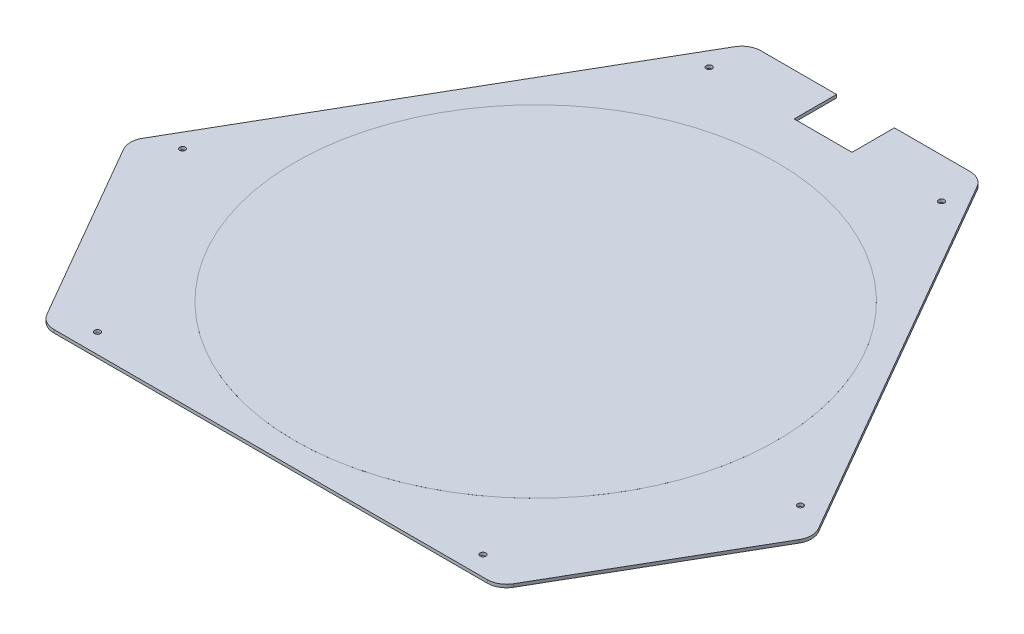
ISO-10303-21;
HEADER;
FILE_DESCRIPTION(('STEP AP214'),'2;1');
FILE_NAME('part.step','',(''),(''),'','','');
FILE_SCHEMA(('AUTOMOTIVE_DESIGN { 1 0 10303 214 1 1 1 1 }'));
ENDSEC;
DATA;
#1=APPLICATION_CONTEXT('core data for automotive mechanical design processes');
#2=APPLICATION_PROTOCOL_DEFINITION('international standard','automotive_design',2000,#1);
#3=PRODUCT_CONTEXT('',#1,'mechanical');
#4=PRODUCT('Part','Part','',(#3));
#5=PRODUCT_RELATED_PRODUCT_CATEGORY('part','',(#4));
#6=PRODUCT_DEFINITION_FORMATION('','',#4);
#7=PRODUCT_DEFINITION_CONTEXT('part definition',#1,'design');
#8=PRODUCT_DEFINITION('design','',#6,#7);
#9=PRODUCT_DEFINITION_SHAPE('','',#8);
#10=(LENGTH_UNIT() NAMED_UNIT(*) SI_UNIT(.MILLI.,.METRE.));
#11=(NAMED_UNIT(*) PLANE_ANGLE_UNIT() SI_UNIT($,.RADIAN.));
#12=(NAMED_UNIT(*) SI_UNIT($,.STERADIAN.) SOLID_ANGLE_UNIT());
#13=UNCERTAINTY_MEASURE_WITH_UNIT(LENGTH_MEASURE(1.E-05),#10,'distance_accuracy_value','');
#14=(GEOMETRIC_REPRESENTATION_CONTEXT(3) GLOBAL_UNCERTAINTY_ASSIGNED_CONTEXT((#13)) GLOBAL_UNIT_ASSIGNED_CONTEXT((#10,
#11,#12)) REPRESENTATION_CONTEXT('',''));
#15=CARTESIAN_POINT('',(0.,0.,0.));
#16=DIRECTION('',(0.,0.,1.));
#17=DIRECTION('',(1.,0.,0.));
#18=AXIS2_PLACEMENT_3D('',#15,#16,#17);
#19=CARTESIAN_POINT('',(60.,1.6,-171.076951545867));
#20=DIRECTION('',(0.,0.,1.));
#21=DIRECTION('',(1.,0.,0.));
#22=AXIS2_PLACEMENT_3D('',#19,#20,#21);
#23=PLANE('',#22);
#24=DIRECTION('',(-1.,0.,0.));
#25=VECTOR('',#24,1.);
#26=CARTESIAN_POINT('',(60.,1.6,-171.076951545867));
#27=LINE('',#26,#25);
#28=CARTESIAN_POINT('',(-15.,1.6,-171.076951545867));
#29=VERTEX_POINT('',#28);
#30=CARTESIAN_POINT('',(-54.2264973081037,1.6,-171.076951545867));
#31=VERTEX_POINT('',#30);
#32=EDGE_CURVE('E199',#29,#31,#27,.T.);
#33=ORIENTED_EDGE('',*,*,#32,.F.);
#34=DIRECTION('',(0.,1.,0.));
#35=VECTOR('',#34,1.);
#36=CARTESIAN_POINT('',(-15.,0.,-171.076951545867));
#37=LINE('',#36,#35);
#38=CARTESIAN_POINT('',(-15.,0.,-171.076951545867));
#39=VERTEX_POINT('',#38);
#40=EDGE_CURVE('E185',#39,#29,#37,.T.);
#41=ORIENTED_EDGE('',*,*,#40,.F.);
#42=DIRECTION('',(-1.,0.,0.));
#43=VECTOR('',#42,1.);
#44=CARTESIAN_POINT('',(60.,0.,-171.076951545867));
#45=LINE('',#44,#43);
#46=CARTESIAN_POINT('',(-54.2264973081037,0.,-171.076951545867));
#47=VERTEX_POINT('',#46);
#48=EDGE_CURVE('E172',#39,#47,#45,.T.);
#49=ORIENTED_EDGE('',*,*,#48,.T.);
#50=DIRECTION('',(0.,-1.,0.));
#51=VECTOR('',#50,1.);
#52=CARTESIAN_POINT('',(-54.2264973081037,1.6,-171.076951545867));
#53=LINE('',#52,#51);
#54=EDGE_CURVE('E211',#47,#31,#53,.F.);
#55=ORIENTED_EDGE('',*,*,#54,.T.);
#56=EDGE_LOOP('',(#33,#41,#49,#55));
#57=FACE_BOUND('',#56,.T.);
#58=ADVANCED_FACE('F38',(#57),#23,.F.);
#59=CARTESIAN_POINT('',(118.156986040721,1.6,137.5));
#60=DIRECTION('',(-0.866025403784438,0.,-0.5));
#61=DIRECTION('',(-0.5,0.,0.866025403784439));
#62=AXIS2_PLACEMENT_3D('',#59,#60,#61);
#63=PLANE('',#62);
#64=DIRECTION('',(0.5,0.,-0.866025403784438));
#65=VECTOR('',#64,1.);
#66=CARTESIAN_POINT('',(118.156986040721,0.,137.5));
#67=LINE('',#66,#65);
#68=CARTESIAN_POINT('',(121.043737386669,0.,132.5));
#69=VERTEX_POINT('',#68);
#70=CARTESIAN_POINT('',(175.270234694772,0.,38.5769515458674));
#71=VERTEX_POINT('',#70);
#72=EDGE_CURVE('E187',#69,#71,#67,.T.);
#73=ORIENTED_EDGE('',*,*,#72,.T.);
#74=DIRECTION('',(0.,-1.,0.));
#75=VECTOR('',#74,1.);
#76=CARTESIAN_POINT('',(175.270234694772,1.6,38.5769515458674));
#77=LINE('',#76,#75);
#78=CARTESIAN_POINT('',(175.270234694772,1.6,38.5769515458674));
#79=VERTEX_POINT('',#78);
#80=EDGE_CURVE('E11',#71,#79,#77,.F.);
#81=ORIENTED_EDGE('',*,*,#80,.T.);
#82=DIRECTION('',(0.5,0.,-0.866025403784438));
#83=VECTOR('',#82,1.);
#84=CARTESIAN_POINT('',(118.156986040721,1.6,137.5));
#85=LINE('',#84,#83);
#86=CARTESIAN_POINT('',(121.043737386669,1.6,132.5));
#87=VERTEX_POINT('',#86);
#88=EDGE_CURVE('E192',#87,#79,#85,.T.);
#89=ORIENTED_EDGE('',*,*,#88,.F.);
#90=DIRECTION('',(0.,-1.,0.));
#91=VECTOR('',#90,1.);
#92=CARTESIAN_POINT('',(121.043737386669,1.6,132.5));
#93=LINE('',#92,#91);
#94=EDGE_CURVE('E46',#87,#69,#93,.T.);
#95=ORIENTED_EDGE('',*,*,#94,.T.);
#96=EDGE_LOOP('',(#73,#81,#89,#95));
#97=FACE_BOUND('',#96,.T.);
#98=ADVANCED_FACE('F279',(#97),#63,.F.);
#99=CARTESIAN_POINT('',(178.156986040721,1.6,33.5769515458674));
#100=DIRECTION('',(-0.866025403784439,0.,0.5));
#101=DIRECTION('',(0.5,0.,0.866025403784439));
#102=AXIS2_PLACEMENT_3D('',#99,#100,#101);
#103=PLANE('',#102);
#104=DIRECTION('',(-0.5,0.,-0.866025403784439));
#105=VECTOR('',#104,1.);
#106=CARTESIAN_POINT('',(178.156986040721,0.,33.5769515458674));
#107=LINE('',#106,#105);
#108=CARTESIAN_POINT('',(175.270234694773,0.,28.5769515458674));
#109=VERTEX_POINT('',#108);
#110=CARTESIAN_POINT('',(62.8867513459482,0.,-166.076951545867));
#111=VERTEX_POINT('',#110);
#112=EDGE_CURVE('E214',#109,#111,#107,.T.);
#113=ORIENTED_EDGE('',*,*,#112,.T.);
#114=DIRECTION('',(0.,-1.,0.));
#115=VECTOR('',#114,1.);
#116=CARTESIAN_POINT('',(62.8867513459482,1.6,-166.076951545867));
#117=LINE('',#116,#115);
#118=CARTESIAN_POINT('',(62.8867513459482,1.6,-166.076951545867));
#119=VERTEX_POINT('',#118);
#120=EDGE_CURVE('E247',#111,#119,#117,.F.);
#121=ORIENTED_EDGE('',*,*,#120,.T.);
#122=DIRECTION('',(-0.5,0.,-0.866025403784439));
#123=VECTOR('',#122,1.);
#124=CARTESIAN_POINT('',(178.156986040721,1.6,33.5769515458674));
#125=LINE('',#124,#123);
#126=CARTESIAN_POINT('',(175.270234694773,1.6,28.5769515458674));
#127=VERTEX_POINT('',#126);
#128=EDGE_CURVE('E195',#127,#119,#125,.T.);
#129=ORIENTED_EDGE('',*,*,#128,.F.);
#130=DIRECTION('',(0.,-1.,0.));
#131=VECTOR('',#130,1.);
#132=CARTESIAN_POINT('',(175.270234694773,1.6,28.5769515458674));
#133=LINE('',#132,#131);
#134=EDGE_CURVE('E244',#127,#109,#133,.T.);
#135=ORIENTED_EDGE('',*,*,#134,.T.);
#136=EDGE_LOOP('',(#113,#121,#129,#135));
#137=FACE_BOUND('',#136,.T.);
#138=ADVANCED_FACE('F291',(#137),#103,.F.);
#139=CARTESIAN_POINT('',(54.2264973081038,0.,-171.076951545867));
#140=VERTEX_POINT('',#139);
#141=CARTESIAN_POINT('',(15.,0.,-171.076951545867));
#142=VERTEX_POINT('',#141);
#143=EDGE_CURVE('E217',#140,#142,#45,.T.);
#144=ORIENTED_EDGE('',*,*,#143,.T.);
#145=DIRECTION('',(0.,1.,0.));
#146=VECTOR('',#145,1.);
#147=CARTESIAN_POINT('',(15.,0.,-171.076951545867));
#148=LINE('',#147,#146);
#149=CARTESIAN_POINT('',(15.,1.6,-171.076951545867));
#150=VERTEX_POINT('',#149);
#151=EDGE_CURVE('E188',#142,#150,#148,.T.);
#152=ORIENTED_EDGE('',*,*,#151,.T.);
#153=CARTESIAN_POINT('',(54.2264973081038,1.6,-171.076951545867));
#154=VERTEX_POINT('',#153);
#155=EDGE_CURVE('E200',#154,#150,#27,.T.);
#156=ORIENTED_EDGE('',*,*,#155,.F.);
#157=DIRECTION('',(0.,-1.,0.));
#158=VECTOR('',#157,1.);
#159=CARTESIAN_POINT('',(54.2264973081038,1.6,-171.076951545867));
#160=LINE('',#159,#158);
#161=EDGE_CURVE('E229',#154,#140,#160,.T.);
#162=ORIENTED_EDGE('',*,*,#161,.T.);
#163=EDGE_LOOP('',(#144,#152,#156,#162));
#164=FACE_BOUND('',#163,.T.);
#165=ADVANCED_FACE('F302',(#164),#23,.F.);
#166=CARTESIAN_POINT('',(-60.,1.6,-171.076951545867));
#167=DIRECTION('',(0.866025403784439,0.,0.5));
#168=DIRECTION('',(0.5,0.,-0.866025403784439));
#169=AXIS2_PLACEMENT_3D('',#166,#167,#168);
#170=PLANE('',#169);
#171=DIRECTION('',(-0.5,0.,0.866025403784439));
#172=VECTOR('',#171,1.);
#173=CARTESIAN_POINT('',(-60.,1.6,-171.076951545867));
#174=LINE('',#173,#172);
#175=CARTESIAN_POINT('',(-62.8867513459481,1.6,-166.076951545867));
#176=VERTEX_POINT('',#175);
#177=CARTESIAN_POINT('',(-175.270234694772,1.6,28.5769515458674));
#178=VERTEX_POINT('',#177);
#179=EDGE_CURVE('E203',#176,#178,#174,.T.);
#180=ORIENTED_EDGE('',*,*,#179,.F.);
#181=DIRECTION('',(0.,-1.,0.));
#182=VECTOR('',#181,1.);
#183=CARTESIAN_POINT('',(-62.8867513459481,1.6,-166.076951545867));
#184=LINE('',#183,#182);
#185=CARTESIAN_POINT('',(-62.8867513459481,0.,-166.076951545867));
#186=VERTEX_POINT('',#185);
#187=EDGE_CURVE('E263',#176,#186,#184,.T.);
#188=ORIENTED_EDGE('',*,*,#187,.T.);
#189=DIRECTION('',(-0.5,0.,0.866025403784439));
#190=VECTOR('',#189,1.);
#191=CARTESIAN_POINT('',(-60.,0.,-171.076951545867));
#192=LINE('',#191,#190);
#193=CARTESIAN_POINT('',(-175.270234694772,0.,28.5769515458674));
#194=VERTEX_POINT('',#193);
#195=EDGE_CURVE('E220',#186,#194,#192,.T.);
#196=ORIENTED_EDGE('',*,*,#195,.T.);
#197=DIRECTION('',(0.,-1.,0.));
#198=VECTOR('',#197,1.);
#199=CARTESIAN_POINT('',(-175.270234694772,1.6,28.5769515458674));
#200=LINE('',#199,#198);
#201=EDGE_CURVE('E261',#194,#178,#200,.F.);
#202=ORIENTED_EDGE('',*,*,#201,.T.);
#203=EDGE_LOOP('',(#180,#188,#196,#202));
#204=FACE_BOUND('',#203,.T.);
#205=ADVANCED_FACE('F326',(#204),#170,.F.);
#206=CARTESIAN_POINT('',(-178.156986040721,1.6,33.5769515458674));
#207=DIRECTION('',(0.866025403784439,0.,-0.5));
#208=DIRECTION('',(-0.5,0.,-0.866025403784439));
#209=AXIS2_PLACEMENT_3D('',#206,#207,#208);
#210=PLANE('',#209);
#211=DIRECTION('',(0.5,0.,0.866025403784439));
#212=VECTOR('',#211,1.);
#213=CARTESIAN_POINT('',(-178.156986040721,1.6,33.5769515458674));
#214=LINE('',#213,#212);
#215=CARTESIAN_POINT('',(-175.270234694773,1.6,38.5769515458674));
#216=VERTEX_POINT('',#215);
#217=CARTESIAN_POINT('',(-121.043737386669,1.6,132.5));
#218=VERTEX_POINT('',#217);
#219=EDGE_CURVE('E206',#216,#218,#214,.T.);
#220=ORIENTED_EDGE('',*,*,#219,.F.);
#221=DIRECTION('',(0.,-1.,0.));
#222=VECTOR('',#221,1.);
#223=CARTESIAN_POINT('',(-175.270234694773,1.6,38.5769515458674));
#224=LINE('',#223,#222);
#225=CARTESIAN_POINT('',(-175.270234694773,0.,38.5769515458674));
#226=VERTEX_POINT('',#225);
#227=EDGE_CURVE('E268',#216,#226,#224,.T.);
#228=ORIENTED_EDGE('',*,*,#227,.T.);
#229=DIRECTION('',(0.5,0.,0.866025403784439));
#230=VECTOR('',#229,1.);
#231=CARTESIAN_POINT('',(-178.156986040721,0.,33.5769515458674));
#232=LINE('',#231,#230);
#233=CARTESIAN_POINT('',(-121.043737386669,0.,132.5));
#234=VERTEX_POINT('',#233);
#235=EDGE_CURVE('E223',#226,#234,#232,.T.);
#236=ORIENTED_EDGE('',*,*,#235,.T.);
#237=DIRECTION('',(0.,-1.,0.));
#238=VECTOR('',#237,1.);
#239=CARTESIAN_POINT('',(-121.043737386669,1.6,132.5));
#240=LINE('',#239,#238);
#241=EDGE_CURVE('E266',#234,#218,#240,.F.);
#242=ORIENTED_EDGE('',*,*,#241,.T.);
#243=EDGE_LOOP('',(#220,#228,#236,#242));
#244=FACE_BOUND('',#243,.T.);
#245=ADVANCED_FACE('F331',(#244),#210,.F.);
#246=CARTESIAN_POINT('',(-118.156986040721,1.6,137.5));
#247=DIRECTION('',(0.,0.,-1.));
#248=DIRECTION('',(-1.,0.,0.));
#249=AXIS2_PLACEMENT_3D('',#246,#247,#248);
#250=PLANE('',#249);
#251=DIRECTION('',(1.,0.,0.));
#252=VECTOR('',#251,1.);
#253=CARTESIAN_POINT('',(-118.156986040721,1.6,137.5));
#254=LINE('',#253,#252);
#255=CARTESIAN_POINT('',(-112.383483348824,1.6,137.5));
#256=VERTEX_POINT('',#255);
#257=CARTESIAN_POINT('',(112.383483348824,1.6,137.5));
#258=VERTEX_POINT('',#257);
#259=EDGE_CURVE('E209',#256,#258,#254,.T.);
#260=ORIENTED_EDGE('',*,*,#259,.F.);
#261=DIRECTION('',(0.,-1.,0.));
#262=VECTOR('',#261,1.);
#263=CARTESIAN_POINT('',(-112.383483348824,1.6,137.5));
#264=LINE('',#263,#262);
#265=CARTESIAN_POINT('',(-112.383483348824,0.,137.5));
#266=VERTEX_POINT('',#265);
#267=EDGE_CURVE('E272',#256,#266,#264,.T.);
#268=ORIENTED_EDGE('',*,*,#267,.T.);
#269=DIRECTION('',(1.,0.,0.));
#270=VECTOR('',#269,1.);
#271=CARTESIAN_POINT('',(-118.156986040721,0.,137.5));
#272=LINE('',#271,#270);
#273=CARTESIAN_POINT('',(112.383483348824,0.,137.5));
#274=VERTEX_POINT('',#273);
#275=EDGE_CURVE('E196',#266,#274,#272,.T.);
#276=ORIENTED_EDGE('',*,*,#275,.T.);
#277=DIRECTION('',(0.,-1.,0.));
#278=VECTOR('',#277,1.);
#279=CARTESIAN_POINT('',(112.383483348824,1.6,137.5));
#280=LINE('',#279,#278);
#281=EDGE_CURVE('E61',#274,#258,#280,.F.);
#282=ORIENTED_EDGE('',*,*,#281,.T.);
#283=EDGE_LOOP('',(#260,#268,#276,#282));
#284=FACE_BOUND('',#283,.T.);
#285=ADVANCED_FACE('F357',(#284),#250,.F.);
#286=CARTESIAN_POINT('',(0.,1.6,0.));
#287=DIRECTION('',(0.,1.,0.));
#288=DIRECTION('',(0.,0.,1.));
#289=AXIS2_PLACEMENT_3D('',#286,#287,#288);
#290=PLANE('',#289);
#291=CARTESIAN_POINT('',(-60.25,1.6,-150.2554075566));
#292=DIRECTION('',(0.,1.,0.));
#293=DIRECTION('',(0.,0.,1.));
#294=AXIS2_PLACEMENT_3D('',#291,#292,#293);
#295=CIRCLE('',#294,1.5);
#296=CARTESIAN_POINT('',(-60.25,1.6,-148.7554075566));
#297=VERTEX_POINT('',#296);
#298=EDGE_CURVE('E388',#297,#297,#295,.T.);
#299=ORIENTED_EDGE('',*,*,#298,.F.);
#300=EDGE_LOOP('',(#299));
#301=FACE_BOUND('',#300,.T.);
#302=CARTESIAN_POINT('',(60.25,1.6,-150.2554075566));
#303=DIRECTION('',(0.,1.,0.));
#304=DIRECTION('',(0.,0.,1.));
#305=AXIS2_PLACEMENT_3D('',#302,#303,#304);
#306=CIRCLE('',#305,1.5);
#307=CARTESIAN_POINT('',(60.25,1.6,-148.7554075566));
#308=VERTEX_POINT('',#307);
#309=EDGE_CURVE('E392',#308,#308,#306,.T.);
#310=ORIENTED_EDGE('',*,*,#309,.F.);
#311=EDGE_LOOP('',(#310));
#312=FACE_BOUND('',#311,.T.);
#313=CARTESIAN_POINT('',(160.25,1.6,22.9496732002877));
#314=DIRECTION('',(0.,1.,0.));
#315=DIRECTION('',(0.,0.,1.));
#316=AXIS2_PLACEMENT_3D('',#313,#314,#315);
#317=CIRCLE('',#316,1.5);
#318=CARTESIAN_POINT('',(160.25,1.6,24.4496732002877));
#319=VERTEX_POINT('',#318);
#320=EDGE_CURVE('E396',#319,#319,#317,.T.);
#321=ORIENTED_EDGE('',*,*,#320,.F.);
#322=EDGE_LOOP('',(#321));
#323=FACE_BOUND('',#322,.T.);
#324=CARTESIAN_POINT('',(100.,1.6,127.305734356312));
#325=DIRECTION('',(0.,1.,0.));
#326=DIRECTION('',(0.,0.,1.));
#327=AXIS2_PLACEMENT_3D('',#324,#325,#326);
#328=CIRCLE('',#327,1.5);
#329=CARTESIAN_POINT('',(100.,1.6,128.805734356312));
#330=VERTEX_POINT('',#329);
#331=EDGE_CURVE('E400',#330,#330,#328,.T.);
#332=ORIENTED_EDGE('',*,*,#331,.F.);
#333=EDGE_LOOP('',(#332));
#334=FACE_BOUND('',#333,.T.);
#335=CARTESIAN_POINT('',(-100.,1.6,127.305734356312));
#336=DIRECTION('',(0.,1.,0.));
#337=DIRECTION('',(0.,0.,1.));
#338=AXIS2_PLACEMENT_3D('',#335,#336,#337);
#339=CIRCLE('',#338,1.5);
#340=CARTESIAN_POINT('',(-100.,1.6,128.805734356312));
#341=VERTEX_POINT('',#340);
#342=EDGE_CURVE('E404',#341,#341,#339,.T.);
#343=ORIENTED_EDGE('',*,*,#342,.F.);
#344=EDGE_LOOP('',(#343));
#345=FACE_BOUND('',#344,.T.);
#346=CARTESIAN_POINT('',(-160.25,1.6,22.9496732002876));
#347=DIRECTION('',(0.,1.,0.));
#348=DIRECTION('',(0.,0.,1.));
#349=AXIS2_PLACEMENT_3D('',#346,#347,#348);
#350=CIRCLE('',#349,1.5);
#351=CARTESIAN_POINT('',(-160.25,1.6,24.4496732002876));
#352=VERTEX_POINT('',#351);
#353=EDGE_CURVE('E408',#352,#352,#350,.T.);
#354=ORIENTED_EDGE('',*,*,#353,.F.);
#355=EDGE_LOOP('',(#354));
#356=FACE_BOUND('',#355,.T.);
#357=CARTESIAN_POINT('',(0.,1.6,0.));
#358=DIRECTION('',(0.,1.,0.));
#359=DIRECTION('',(0.,0.,1.));
#360=AXIS2_PLACEMENT_3D('',#357,#358,#359);
#361=CIRCLE('',#360,125.);
#362=CARTESIAN_POINT('',(0.,1.6,-125.));
#363=VERTEX_POINT('',#362);
#364=EDGE_CURVE('E178',#363,#363,#361,.T.);
#365=ORIENTED_EDGE('',*,*,#364,.F.);
#366=EDGE_LOOP('',(#365));
#367=FACE_BOUND('',#366,.T.);
#368=DIRECTION('',(0.,0.,1.));
#369=VECTOR('',#368,1.);
#370=CARTESIAN_POINT('',(-15.,1.6,-171.076951545867));
#371=LINE('',#370,#369);
#372=CARTESIAN_POINT('',(-15.,1.6,-149.076951545867));
#373=VERTEX_POINT('',#372);
#374=EDGE_CURVE('E158',#29,#373,#371,.T.);
#375=ORIENTED_EDGE('',*,*,#374,.F.);
#376=ORIENTED_EDGE('',*,*,#32,.T.);
#377=CARTESIAN_POINT('',(-54.2264973081037,1.6,-161.076951545867));
#378=DIRECTION('',(0.,1.,0.));
#379=DIRECTION('',(0.,0.,1.));
#380=AXIS2_PLACEMENT_3D('',#377,#378,#379);
#381=CIRCLE('',#380,10.);
#382=EDGE_CURVE('E257',#31,#176,#381,.T.);
#383=ORIENTED_EDGE('',*,*,#382,.T.);
#384=ORIENTED_EDGE('',*,*,#179,.T.);
#385=CARTESIAN_POINT('',(-166.609980656928,1.6,33.5769515458674));
#386=DIRECTION('',(0.,1.,0.));
#387=DIRECTION('',(0.,0.,1.));
#388=AXIS2_PLACEMENT_3D('',#385,#386,#387);
#389=CIRCLE('',#388,10.);
#390=EDGE_CURVE('E255',#178,#216,#389,.T.);
#391=ORIENTED_EDGE('',*,*,#390,.T.);
#392=ORIENTED_EDGE('',*,*,#219,.T.);
#393=CARTESIAN_POINT('',(-112.383483348824,1.6,127.5));
#394=DIRECTION('',(0.,1.,0.));
#395=DIRECTION('',(0.,0.,1.));
#396=AXIS2_PLACEMENT_3D('',#393,#394,#395);
#397=CIRCLE('',#396,10.);
#398=EDGE_CURVE('E253',#218,#256,#397,.T.);
#399=ORIENTED_EDGE('',*,*,#398,.T.);
#400=ORIENTED_EDGE('',*,*,#259,.T.);
#401=CARTESIAN_POINT('',(112.383483348824,1.6,127.5));
#402=DIRECTION('',(0.,1.,0.));
#403=DIRECTION('',(0.,0.,1.));
#404=AXIS2_PLACEMENT_3D('',#401,#402,#403);
#405=CIRCLE('',#404,10.);
#406=EDGE_CURVE('E249',#258,#87,#405,.T.);
#407=ORIENTED_EDGE('',*,*,#406,.T.);
#408=ORIENTED_EDGE('',*,*,#88,.T.);
#409=CARTESIAN_POINT('',(166.609980656928,1.6,33.5769515458674));
#410=DIRECTION('',(0.,1.,0.));
#411=DIRECTION('',(0.,0.,1.));
#412=AXIS2_PLACEMENT_3D('',#409,#410,#411);
#413=CIRCLE('',#412,10.);
#414=EDGE_CURVE('E251',#79,#127,#413,.T.);
#415=ORIENTED_EDGE('',*,*,#414,.T.);
#416=ORIENTED_EDGE('',*,*,#128,.T.);
#417=CARTESIAN_POINT('',(54.2264973081038,1.6,-161.076951545867));
#418=DIRECTION('',(0.,1.,0.));
#419=DIRECTION('',(0.,0.,1.));
#420=AXIS2_PLACEMENT_3D('',#417,#418,#419);
#421=CIRCLE('',#420,10.);
#422=EDGE_CURVE('E259',#119,#154,#421,.T.);
#423=ORIENTED_EDGE('',*,*,#422,.T.);
#424=ORIENTED_EDGE('',*,*,#155,.T.);
#425=DIRECTION('',(0.,0.,-1.));
#426=VECTOR('',#425,1.);
#427=CARTESIAN_POINT('',(15.,1.6,-171.076951545867));
#428=LINE('',#427,#426);
#429=CARTESIAN_POINT('',(15.,1.6,-149.076951545867));
#430=VERTEX_POINT('',#429);
#431=EDGE_CURVE('E173',#430,#150,#428,.T.);
#432=ORIENTED_EDGE('',*,*,#431,.F.);
#433=DIRECTION('',(1.,0.,0.));
#434=VECTOR('',#433,1.);
#435=CARTESIAN_POINT('',(-15.,1.6,-149.076951545867));
#436=LINE('',#435,#434);
#437=EDGE_CURVE('E175',#373,#430,#436,.T.);
#438=ORIENTED_EDGE('',*,*,#437,.F.);
#439=EDGE_LOOP('',(#375,#376,#383,#384,#391,#392,#399,#400,#407,#408,#415,#416,#423,#424,#432,#438));
#440=FACE_BOUND('',#439,.T.);
#441=ADVANCED_FACE('F295',(#301,#312,#323,#334,#345,#356,#367,#440),#290,.T.);
#442=CARTESIAN_POINT('',(0.,0.,0.));
#443=DIRECTION('',(0.,1.,0.));
#444=DIRECTION('',(0.,0.,1.));
#445=AXIS2_PLACEMENT_3D('',#442,#443,#444);
#446=PLANE('',#445);
#447=CARTESIAN_POINT('',(-60.25,0.,-150.2554075566));
#448=DIRECTION('',(0.,1.,0.));
#449=DIRECTION('',(0.,0.,1.));
#450=AXIS2_PLACEMENT_3D('',#447,#448,#449);
#451=CIRCLE('',#450,1.5);
#452=CARTESIAN_POINT('',(-60.25,0.,-148.7554075566));
#453=VERTEX_POINT('',#452);
#454=EDGE_CURVE('E436',#453,#453,#451,.T.);
#455=ORIENTED_EDGE('',*,*,#454,.T.);
#456=EDGE_LOOP('',(#455));
#457=FACE_BOUND('',#456,.T.);
#458=CARTESIAN_POINT('',(60.25,0.,-150.2554075566));
#459=DIRECTION('',(0.,1.,0.));
#460=DIRECTION('',(0.,0.,1.));
#461=AXIS2_PLACEMENT_3D('',#458,#459,#460);
#462=CIRCLE('',#461,1.5);
#463=CARTESIAN_POINT('',(60.25,0.,-148.7554075566));
#464=VERTEX_POINT('',#463);
#465=EDGE_CURVE('E432',#464,#464,#462,.T.);
#466=ORIENTED_EDGE('',*,*,#465,.T.);
#467=EDGE_LOOP('',(#466));
#468=FACE_BOUND('',#467,.T.);
#469=CARTESIAN_POINT('',(160.25,0.,22.9496732002877));
#470=DIRECTION('',(0.,1.,0.));
#471=DIRECTION('',(0.,0.,1.));
#472=AXIS2_PLACEMENT_3D('',#469,#470,#471);
#473=CIRCLE('',#472,1.5);
#474=CARTESIAN_POINT('',(160.25,0.,24.4496732002877));
#475=VERTEX_POINT('',#474);
#476=EDGE_CURVE('E428',#475,#475,#473,.T.);
#477=ORIENTED_EDGE('',*,*,#476,.T.);
#478=EDGE_LOOP('',(#477));
#479=FACE_BOUND('',#478,.T.);
#480=CARTESIAN_POINT('',(100.,0.,127.305734356312));
#481=DIRECTION('',(0.,1.,0.));
#482=DIRECTION('',(0.,0.,1.));
#483=AXIS2_PLACEMENT_3D('',#480,#481,#482);
#484=CIRCLE('',#483,1.5);
#485=CARTESIAN_POINT('',(100.,0.,128.805734356312));
#486=VERTEX_POINT('',#485);
#487=EDGE_CURVE('E424',#486,#486,#484,.T.);
#488=ORIENTED_EDGE('',*,*,#487,.T.);
#489=EDGE_LOOP('',(#488));
#490=FACE_BOUND('',#489,.T.);
#491=CARTESIAN_POINT('',(-100.,0.,127.305734356312));
#492=DIRECTION('',(0.,1.,0.));
#493=DIRECTION('',(0.,0.,1.));
#494=AXIS2_PLACEMENT_3D('',#491,#492,#493);
#495=CIRCLE('',#494,1.5);
#496=CARTESIAN_POINT('',(-100.,0.,128.805734356312));
#497=VERTEX_POINT('',#496);
#498=EDGE_CURVE('E418',#497,#497,#495,.T.);
#499=ORIENTED_EDGE('',*,*,#498,.T.);
#500=EDGE_LOOP('',(#499));
#501=FACE_BOUND('',#500,.T.);
#502=CARTESIAN_POINT('',(-160.25,0.,22.9496732002876));
#503=DIRECTION('',(0.,1.,0.));
#504=DIRECTION('',(0.,0.,1.));
#505=AXIS2_PLACEMENT_3D('',#502,#503,#504);
#506=CIRCLE('',#505,1.5);
#507=CARTESIAN_POINT('',(-160.25,0.,24.4496732002876));
#508=VERTEX_POINT('',#507);
#509=EDGE_CURVE('E412',#508,#508,#506,.T.);
#510=ORIENTED_EDGE('',*,*,#509,.T.);
#511=EDGE_LOOP('',(#510));
#512=FACE_BOUND('',#511,.T.);
#513=ORIENTED_EDGE('',*,*,#48,.F.);
#514=DIRECTION('',(0.,0.,1.));
#515=VECTOR('',#514,1.);
#516=CARTESIAN_POINT('',(-15.,0.,-171.076951545867));
#517=LINE('',#516,#515);
#518=CARTESIAN_POINT('',(-15.,0.,-149.076951545867));
#519=VERTEX_POINT('',#518);
#520=EDGE_CURVE('E155',#39,#519,#517,.T.);
#521=ORIENTED_EDGE('',*,*,#520,.T.);
#522=DIRECTION('',(1.,0.,0.));
#523=VECTOR('',#522,1.);
#524=CARTESIAN_POINT('',(-15.,0.,-149.076951545867));
#525=LINE('',#524,#523);
#526=CARTESIAN_POINT('',(15.,0.,-149.076951545867));
#527=VERTEX_POINT('',#526);
#528=EDGE_CURVE('E165',#519,#527,#525,.T.);
#529=ORIENTED_EDGE('',*,*,#528,.T.);
#530=DIRECTION('',(0.,0.,-1.));
#531=VECTOR('',#530,1.);
#532=CARTESIAN_POINT('',(15.,0.,-171.076951545867));
#533=LINE('',#532,#531);
#534=EDGE_CURVE('E53',#527,#142,#533,.T.);
#535=ORIENTED_EDGE('',*,*,#534,.T.);
#536=ORIENTED_EDGE('',*,*,#143,.F.);
#537=CARTESIAN_POINT('',(54.2264973081038,0.,-161.076951545867));
#538=DIRECTION('',(0.,1.,0.));
#539=DIRECTION('',(0.,0.,1.));
#540=AXIS2_PLACEMENT_3D('',#537,#538,#539);
#541=CIRCLE('',#540,10.);
#542=EDGE_CURVE('E242',#140,#111,#541,.F.);
#543=ORIENTED_EDGE('',*,*,#542,.T.);
#544=ORIENTED_EDGE('',*,*,#112,.F.);
#545=CARTESIAN_POINT('',(166.609980656928,0.,33.5769515458674));
#546=DIRECTION('',(0.,1.,0.));
#547=DIRECTION('',(0.,0.,1.));
#548=AXIS2_PLACEMENT_3D('',#545,#546,#547);
#549=CIRCLE('',#548,10.);
#550=EDGE_CURVE('E234',#109,#71,#549,.F.);
#551=ORIENTED_EDGE('',*,*,#550,.T.);
#552=ORIENTED_EDGE('',*,*,#72,.F.);
#553=CARTESIAN_POINT('',(112.383483348824,0.,127.5));
#554=DIRECTION('',(0.,1.,0.));
#555=DIRECTION('',(0.,0.,1.));
#556=AXIS2_PLACEMENT_3D('',#553,#554,#555);
#557=CIRCLE('',#556,10.);
#558=EDGE_CURVE('E232',#69,#274,#557,.F.);
#559=ORIENTED_EDGE('',*,*,#558,.T.);
#560=ORIENTED_EDGE('',*,*,#275,.F.);
#561=CARTESIAN_POINT('',(-112.383483348824,0.,127.5));
#562=DIRECTION('',(0.,1.,0.));
#563=DIRECTION('',(0.,0.,1.));
#564=AXIS2_PLACEMENT_3D('',#561,#562,#563);
#565=CIRCLE('',#564,10.);
#566=EDGE_CURVE('E236',#266,#234,#565,.F.);
#567=ORIENTED_EDGE('',*,*,#566,.T.);
#568=ORIENTED_EDGE('',*,*,#235,.F.);
#569=CARTESIAN_POINT('',(-166.609980656928,0.,33.5769515458674));
#570=DIRECTION('',(0.,1.,0.));
#571=DIRECTION('',(0.,0.,1.));
#572=AXIS2_PLACEMENT_3D('',#569,#570,#571);
#573=CIRCLE('',#572,10.);
#574=EDGE_CURVE('E238',#226,#194,#573,.F.);
#575=ORIENTED_EDGE('',*,*,#574,.T.);
#576=ORIENTED_EDGE('',*,*,#195,.F.);
#577=CARTESIAN_POINT('',(-54.2264973081037,0.,-161.076951545867));
#578=DIRECTION('',(0.,1.,0.));
#579=DIRECTION('',(0.,0.,1.));
#580=AXIS2_PLACEMENT_3D('',#577,#578,#579);
#581=CIRCLE('',#580,10.);
#582=EDGE_CURVE('E240',#186,#47,#581,.F.);
#583=ORIENTED_EDGE('',*,*,#582,.T.);
#584=EDGE_LOOP('',(#513,#521,#529,#535,#536,#543,#544,#551,#552,#559,#560,#567,#568,#575,#576,#583));
#585=FACE_BOUND('',#584,.T.);
#586=ADVANCED_FACE('F170',(#457,#468,#479,#490,#501,#512,#585),#446,.F.);
#587=CARTESIAN_POINT('',(54.2264973081038,1.6,-161.076951545867));
#588=DIRECTION('',(0.,-1.,0.));
#589=DIRECTION('',(0.,0.,-1.));
#590=AXIS2_PLACEMENT_3D('',#587,#588,#589);
#591=CYLINDRICAL_SURFACE('',#590,10.);
#592=ORIENTED_EDGE('',*,*,#422,.F.);
#593=ORIENTED_EDGE('',*,*,#120,.F.);
#594=ORIENTED_EDGE('',*,*,#542,.F.);
#595=ORIENTED_EDGE('',*,*,#161,.F.);
#596=EDGE_LOOP('',(#592,#593,#594,#595));
#597=FACE_BOUND('',#596,.T.);
#598=ADVANCED_FACE('F299',(#597),#591,.T.);
#599=CARTESIAN_POINT('',(-54.2264973081037,1.6,-161.076951545867));
#600=DIRECTION('',(0.,-1.,0.));
#601=DIRECTION('',(0.,0.,-1.));
#602=AXIS2_PLACEMENT_3D('',#599,#600,#601);
#603=CYLINDRICAL_SURFACE('',#602,10.);
#604=ORIENTED_EDGE('',*,*,#382,.F.);
#605=ORIENTED_EDGE('',*,*,#54,.F.);
#606=ORIENTED_EDGE('',*,*,#582,.F.);
#607=ORIENTED_EDGE('',*,*,#187,.F.);
#608=EDGE_LOOP('',(#604,#605,#606,#607));
#609=FACE_BOUND('',#608,.T.);
#610=ADVANCED_FACE('F338',(#609),#603,.T.);
#611=CARTESIAN_POINT('',(-166.609980656928,1.6,33.5769515458674));
#612=DIRECTION('',(0.,-1.,0.));
#613=DIRECTION('',(0.,0.,-1.));
#614=AXIS2_PLACEMENT_3D('',#611,#612,#613);
#615=CYLINDRICAL_SURFACE('',#614,10.);
#616=ORIENTED_EDGE('',*,*,#390,.F.);
#617=ORIENTED_EDGE('',*,*,#201,.F.);
#618=ORIENTED_EDGE('',*,*,#574,.F.);
#619=ORIENTED_EDGE('',*,*,#227,.F.);
#620=EDGE_LOOP('',(#616,#617,#618,#619));
#621=FACE_BOUND('',#620,.T.);
#622=ADVANCED_FACE('F341',(#621),#615,.T.);
#623=CARTESIAN_POINT('',(-112.383483348824,1.6,127.5));
#624=DIRECTION('',(0.,-1.,0.));
#625=DIRECTION('',(0.,0.,-1.));
#626=AXIS2_PLACEMENT_3D('',#623,#624,#625);
#627=CYLINDRICAL_SURFACE('',#626,10.);
#628=ORIENTED_EDGE('',*,*,#398,.F.);
#629=ORIENTED_EDGE('',*,*,#241,.F.);
#630=ORIENTED_EDGE('',*,*,#566,.F.);
#631=ORIENTED_EDGE('',*,*,#267,.F.);
#632=EDGE_LOOP('',(#628,#629,#630,#631));
#633=FACE_BOUND('',#632,.T.);
#634=ADVANCED_FACE('F345',(#633),#627,.T.);
#635=CARTESIAN_POINT('',(166.609980656928,1.6,33.5769515458674));
#636=DIRECTION('',(0.,-1.,0.));
#637=DIRECTION('',(0.,0.,-1.));
#638=AXIS2_PLACEMENT_3D('',#635,#636,#637);
#639=CYLINDRICAL_SURFACE('',#638,10.);
#640=ORIENTED_EDGE('',*,*,#414,.F.);
#641=ORIENTED_EDGE('',*,*,#80,.F.);
#642=ORIENTED_EDGE('',*,*,#550,.F.);
#643=ORIENTED_EDGE('',*,*,#134,.F.);
#644=EDGE_LOOP('',(#640,#641,#642,#643));
#645=FACE_BOUND('',#644,.T.);
#646=ADVANCED_FACE('F288',(#645),#639,.T.);
#647=CARTESIAN_POINT('',(112.383483348824,1.6,127.5));
#648=DIRECTION('',(0.,-1.,0.));
#649=DIRECTION('',(0.,0.,-1.));
#650=AXIS2_PLACEMENT_3D('',#647,#648,#649);
#651=CYLINDRICAL_SURFACE('',#650,10.);
#652=ORIENTED_EDGE('',*,*,#406,.F.);
#653=ORIENTED_EDGE('',*,*,#281,.F.);
#654=ORIENTED_EDGE('',*,*,#558,.F.);
#655=ORIENTED_EDGE('',*,*,#94,.F.);
#656=EDGE_LOOP('',(#652,#653,#654,#655));
#657=FACE_BOUND('',#656,.T.);
#658=ADVANCED_FACE('F40',(#657),#651,.T.);
#659=CARTESIAN_POINT('',(-15.,0.,-171.076951545867));
#660=DIRECTION('',(-1.,0.,0.));
#661=DIRECTION('',(0.,0.,1.));
#662=AXIS2_PLACEMENT_3D('',#659,#660,#661);
#663=PLANE('',#662);
#664=ORIENTED_EDGE('',*,*,#374,.T.);
#665=DIRECTION('',(0.,1.,0.));
#666=VECTOR('',#665,1.);
#667=CARTESIAN_POINT('',(-15.,0.,-149.076951545867));
#668=LINE('',#667,#666);
#669=EDGE_CURVE('E151',#519,#373,#668,.T.);
#670=ORIENTED_EDGE('',*,*,#669,.F.);
#671=ORIENTED_EDGE('',*,*,#520,.F.);
#672=ORIENTED_EDGE('',*,*,#40,.T.);
#673=EDGE_LOOP('',(#664,#670,#671,#672));
#674=FACE_BOUND('',#673,.T.);
#675=ADVANCED_FACE('F153',(#674),#663,.F.);
#676=CARTESIAN_POINT('',(15.,0.,-171.076951545867));
#677=DIRECTION('',(1.,0.,0.));
#678=DIRECTION('',(0.,0.,-1.));
#679=AXIS2_PLACEMENT_3D('',#676,#677,#678);
#680=PLANE('',#679);
#681=ORIENTED_EDGE('',*,*,#431,.T.);
#682=ORIENTED_EDGE('',*,*,#151,.F.);
#683=ORIENTED_EDGE('',*,*,#534,.F.);
#684=DIRECTION('',(0.,1.,0.));
#685=VECTOR('',#684,1.);
#686=CARTESIAN_POINT('',(15.,0.,-149.076951545867));
#687=LINE('',#686,#685);
#688=EDGE_CURVE('E162',#527,#430,#687,.T.);
#689=ORIENTED_EDGE('',*,*,#688,.T.);
#690=EDGE_LOOP('',(#681,#682,#683,#689));
#691=FACE_BOUND('',#690,.T.);
#692=ADVANCED_FACE('F304',(#691),#680,.F.);
#693=CARTESIAN_POINT('',(-15.,0.,-149.076951545867));
#694=DIRECTION('',(0.,0.,1.));
#695=DIRECTION('',(1.,0.,0.));
#696=AXIS2_PLACEMENT_3D('',#693,#694,#695);
#697=PLANE('',#696);
#698=ORIENTED_EDGE('',*,*,#437,.T.);
#699=ORIENTED_EDGE('',*,*,#688,.F.);
#700=ORIENTED_EDGE('',*,*,#528,.F.);
#701=ORIENTED_EDGE('',*,*,#669,.T.);
#702=EDGE_LOOP('',(#698,#699,#700,#701));
#703=FACE_BOUND('',#702,.T.);
#704=ADVANCED_FACE('F166',(#703),#697,.F.);
#705=CARTESIAN_POINT('',(0.,1.61,0.));
#706=DIRECTION('',(0.,-1.,0.));
#707=DIRECTION('',(0.,0.,-1.));
#708=AXIS2_PLACEMENT_3D('',#705,#706,#707);
#709=CYLINDRICAL_SURFACE('',#708,125.);
#710=CARTESIAN_POINT('',(0.,1.61,0.));
#711=DIRECTION('',(0.,1.,0.));
#712=DIRECTION('',(0.,0.,1.));
#713=AXIS2_PLACEMENT_3D('',#710,#711,#712);
#714=CIRCLE('',#713,125.);
#715=CARTESIAN_POINT('',(0.,1.61,-125.));
#716=VERTEX_POINT('',#715);
#717=EDGE_CURVE('E183',#716,#716,#714,.T.);
#718=CARTESIAN_POINT('',(0.,1.61,-125.));
#719=CARTESIAN_POINT('',(0.,1.60989583333333,-125.));
#720=CARTESIAN_POINT('',(0.,1.60979166666667,-125.));
#721=CARTESIAN_POINT('',(0.,1.60958333333333,-125.));
#722=CARTESIAN_POINT('',(0.,1.60947916666667,-125.));
#723=CARTESIAN_POINT('',(0.,1.60927083333333,-125.));
#724=CARTESIAN_POINT('',(0.,1.60916666666667,-125.));
#725=CARTESIAN_POINT('',(0.,1.60895833333333,-125.));
#726=CARTESIAN_POINT('',(0.,1.60885416666667,-125.));
#727=CARTESIAN_POINT('',(0.,1.60864583333333,-125.));
#728=CARTESIAN_POINT('',(0.,1.60854166666667,-125.));
#729=CARTESIAN_POINT('',(0.,1.60833333333333,-125.));
#730=CARTESIAN_POINT('',(0.,1.60822916666667,-125.));
#731=CARTESIAN_POINT('',(0.,1.60802083333333,-125.));
#732=CARTESIAN_POINT('',(0.,1.60791666666667,-125.));
#733=CARTESIAN_POINT('',(0.,1.60770833333333,-125.));
#734=CARTESIAN_POINT('',(0.,1.60760416666667,-125.));
#735=CARTESIAN_POINT('',(0.,1.60739583333333,-125.));
#736=CARTESIAN_POINT('',(0.,1.60729166666667,-125.));
#737=CARTESIAN_POINT('',(0.,1.60708333333333,-125.));
#738=CARTESIAN_POINT('',(0.,1.60697916666667,-125.));
#739=CARTESIAN_POINT('',(0.,1.60677083333333,-125.));
#740=CARTESIAN_POINT('',(0.,1.60666666666667,-125.));
#741=CARTESIAN_POINT('',(0.,1.60645833333333,-125.));
#742=CARTESIAN_POINT('',(0.,1.60635416666667,-125.));
#743=CARTESIAN_POINT('',(0.,1.60614583333333,-125.));
#744=CARTESIAN_POINT('',(0.,1.60604166666667,-125.));
#745=CARTESIAN_POINT('',(0.,1.60583333333333,-125.));
#746=CARTESIAN_POINT('',(0.,1.60572916666667,-125.));
#747=CARTESIAN_POINT('',(0.,1.60552083333333,-125.));
#748=CARTESIAN_POINT('',(0.,1.60541666666667,-125.));
#749=CARTESIAN_POINT('',(0.,1.60520833333333,-125.));
#750=CARTESIAN_POINT('',(0.,1.60510416666667,-125.));
#751=CARTESIAN_POINT('',(0.,1.60489583333333,-125.));
#752=CARTESIAN_POINT('',(0.,1.60479166666667,-125.));
#753=CARTESIAN_POINT('',(0.,1.60458333333333,-125.));
#754=CARTESIAN_POINT('',(0.,1.60447916666667,-125.));
#755=CARTESIAN_POINT('',(0.,1.60427083333333,-125.));
#756=CARTESIAN_POINT('',(0.,1.60416666666667,-125.));
#757=CARTESIAN_POINT('',(0.,1.60395833333333,-125.));
#758=CARTESIAN_POINT('',(0.,1.60385416666667,-125.));
#759=CARTESIAN_POINT('',(0.,1.60364583333333,-125.));
#760=CARTESIAN_POINT('',(0.,1.60354166666667,-125.));
#761=CARTESIAN_POINT('',(0.,1.60333333333333,-125.));
#762=CARTESIAN_POINT('',(0.,1.60322916666667,-125.));
#763=CARTESIAN_POINT('',(0.,1.60302083333333,-125.));
#764=CARTESIAN_POINT('',(0.,1.60291666666667,-125.));
#765=CARTESIAN_POINT('',(0.,1.60270833333333,-125.));
#766=CARTESIAN_POINT('',(0.,1.60260416666667,-125.));
#767=CARTESIAN_POINT('',(0.,1.60239583333333,-125.));
#768=CARTESIAN_POINT('',(0.,1.60229166666667,-125.));
#769=CARTESIAN_POINT('',(0.,1.60208333333333,-125.));
#770=CARTESIAN_POINT('',(0.,1.60197916666667,-125.));
#771=CARTESIAN_POINT('',(0.,1.60177083333333,-125.));
#772=CARTESIAN_POINT('',(0.,1.60166666666667,-125.));
#773=CARTESIAN_POINT('',(0.,1.60145833333333,-125.));
#774=CARTESIAN_POINT('',(0.,1.60135416666667,-125.));
#775=CARTESIAN_POINT('',(0.,1.60114583333333,-125.));
#776=CARTESIAN_POINT('',(0.,1.60104166666667,-125.));
#777=CARTESIAN_POINT('',(0.,1.60083333333333,-125.));
#778=CARTESIAN_POINT('',(0.,1.60072916666667,-125.));
#779=CARTESIAN_POINT('',(0.,1.60052083333333,-125.));
#780=CARTESIAN_POINT('',(0.,1.60041666666667,-125.));
#781=CARTESIAN_POINT('',(0.,1.60020833333333,-125.));
#782=CARTESIAN_POINT('',(0.,1.60010416666667,-125.));
#783=CARTESIAN_POINT('',(0.,1.6,-125.));
#784=B_SPLINE_CURVE_WITH_KNOTS('',3,(#718,#719,#720,#721,#722,#723,#724,#725,#726,#727,#728,
#729,#730,#731,#732,#733,#734,#735,#736,#737,#738,#739,#740,#741,#742,#743,#744,#745,#746,#747,
#748,#749,#750,#751,#752,#753,#754,#755,#756,#757,#758,#759,#760,#761,#762,#763,#764,#765,#766,
#767,#768,#769,#770,#771,#772,#773,#774,#775,#776,#777,#778,#779,#780,#781,#782,#783),
.UNSPECIFIED.,.F.,.F.,(4,2,2,2,2,2,2,2,2,2,2,2,2,2,2,2,2,2,2,2,2,2,2,2,2,2,2,2,2,2,2,2,4),(0.,
0.000312500000000096,0.000625000000000191,0.00093750000000007,0.00125000000000017,
0.00156250000000004,0.00187500000000014,0.00218750000000002,0.00250000000000011,
0.00281250000000021,0.00312500000000009,0.00343750000000019,0.00375000000000006,
0.00406250000000016,0.00437500000000004,0.00468750000000013,0.00500000000000001,
0.00531250000000011,0.0056250000000002,0.00593750000000008,0.00625000000000018,
0.00656250000000006,0.00687500000000015,0.00718750000000003,0.00750000000000013,
0.00781250000000022,0.0081250000000001,0.0084375000000002,0.00875000000000008,
0.00906250000000017,0.00937500000000005,0.00968750000000015,0.01),.UNSPECIFIED.);
#785=EDGE_CURVE('BSEAM311',#716,#363,#784,.T.);
#786=ORIENTED_EDGE('',*,*,#717,.F.);
#787=ORIENTED_EDGE('',*,*,#364,.T.);
#788=ORIENTED_EDGE('',*,*,#785,.T.);
#789=ORIENTED_EDGE('',*,*,#785,.F.);
#790=EDGE_LOOP('',(#786,#788,#787,#789));
#791=FACE_BOUND('',#790,.T.);
#792=ADVANCED_FACE('F311',(#791),#709,.T.);
#793=CARTESIAN_POINT('',(0.,1.61,0.));
#794=DIRECTION('',(0.,1.,0.));
#795=DIRECTION('',(0.,0.,1.));
#796=AXIS2_PLACEMENT_3D('',#793,#794,#795);
#797=PLANE('',#796);
#798=ORIENTED_EDGE('',*,*,#717,.T.);
#799=EDGE_LOOP('',(#798));
#800=FACE_BOUND('',#799,.T.);
#801=ADVANCED_FACE('F467',(#800),#797,.T.);
#802=CARTESIAN_POINT('',(-160.25,1.6,22.9496732002876));
#803=DIRECTION('',(0.,1.,0.));
#804=DIRECTION('',(0.,0.,1.));
#805=AXIS2_PLACEMENT_3D('',#802,#803,#804);
#806=CYLINDRICAL_SURFACE('',#805,1.5);
#807=ORIENTED_EDGE('',*,*,#509,.F.);
#808=EDGE_LOOP('',(#807));
#809=FACE_BOUND('',#808,.T.);
#810=ORIENTED_EDGE('',*,*,#353,.T.);
#811=EDGE_LOOP('',(#810));
#812=FACE_BOUND('',#811,.T.);
#813=ADVANCED_FACE('F463',(#809,#812),#806,.F.);
#814=CARTESIAN_POINT('',(-100.,1.6,127.305734356312));
#815=DIRECTION('',(0.,1.,0.));
#816=DIRECTION('',(0.,0.,1.));
#817=AXIS2_PLACEMENT_3D('',#814,#815,#816);
#818=CYLINDRICAL_SURFACE('',#817,1.5);
#819=ORIENTED_EDGE('',*,*,#498,.F.);
#820=EDGE_LOOP('',(#819));
#821=FACE_BOUND('',#820,.T.);
#822=ORIENTED_EDGE('',*,*,#342,.T.);
#823=EDGE_LOOP('',(#822));
#824=FACE_BOUND('',#823,.T.);
#825=ADVANCED_FACE('F459',(#821,#824),#818,.F.);
#826=CARTESIAN_POINT('',(100.,1.6,127.305734356312));
#827=DIRECTION('',(0.,1.,0.));
#828=DIRECTION('',(0.,0.,1.));
#829=AXIS2_PLACEMENT_3D('',#826,#827,#828);
#830=CYLINDRICAL_SURFACE('',#829,1.5);
#831=ORIENTED_EDGE('',*,*,#487,.F.);
#832=EDGE_LOOP('',(#831));
#833=FACE_BOUND('',#832,.T.);
#834=ORIENTED_EDGE('',*,*,#331,.T.);
#835=EDGE_LOOP('',(#834));
#836=FACE_BOUND('',#835,.T.);
#837=ADVANCED_FACE('F455',(#833,#836),#830,.F.);
#838=CARTESIAN_POINT('',(160.25,1.6,22.9496732002877));
#839=DIRECTION('',(0.,1.,0.));
#840=DIRECTION('',(0.,0.,1.));
#841=AXIS2_PLACEMENT_3D('',#838,#839,#840);
#842=CYLINDRICAL_SURFACE('',#841,1.5);
#843=ORIENTED_EDGE('',*,*,#476,.F.);
#844=EDGE_LOOP('',(#843));
#845=FACE_BOUND('',#844,.T.);
#846=ORIENTED_EDGE('',*,*,#320,.T.);
#847=EDGE_LOOP('',(#846));
#848=FACE_BOUND('',#847,.T.);
#849=ADVANCED_FACE('F448',(#845,#848),#842,.F.);
#850=CARTESIAN_POINT('',(60.25,1.6,-150.2554075566));
#851=DIRECTION('',(0.,1.,0.));
#852=DIRECTION('',(0.,0.,1.));
#853=AXIS2_PLACEMENT_3D('',#850,#851,#852);
#854=CYLINDRICAL_SURFACE('',#853,1.5);
#855=ORIENTED_EDGE('',*,*,#465,.F.);
#856=EDGE_LOOP('',(#855));
#857=FACE_BOUND('',#856,.T.);
#858=ORIENTED_EDGE('',*,*,#309,.T.);
#859=EDGE_LOOP('',(#858));
#860=FACE_BOUND('',#859,.T.);
#861=ADVANCED_FACE('F442',(#857,#860),#854,.F.);
#862=CARTESIAN_POINT('',(-60.25,1.6,-150.2554075566));
#863=DIRECTION('',(0.,1.,0.));
#864=DIRECTION('',(0.,0.,1.));
#865=AXIS2_PLACEMENT_3D('',#862,#863,#864);
#866=CYLINDRICAL_SURFACE('',#865,1.5);
#867=ORIENTED_EDGE('',*,*,#454,.F.);
#868=EDGE_LOOP('',(#867));
#869=FACE_BOUND('',#868,.T.);
#870=ORIENTED_EDGE('',*,*,#298,.T.);
#871=EDGE_LOOP('',(#870));
#872=FACE_BOUND('',#871,.T.);
#873=ADVANCED_FACE('F440',(#869,#872),#866,.F.);
#874=CLOSED_SHELL('',(#58,#98,#138,#165,#205,#245,#285,#441,#586,#598,#610,#622,#634,#646,#658,
#675,#692,#704,#792,#801,#813,#825,#837,#849,#861,#873));
#875=MANIFOLD_SOLID_BREP('B2',#874);
#876=ADVANCED_BREP_SHAPE_REPRESENTATION('',(#18,#875),#14);
#877=SHAPE_DEFINITION_REPRESENTATION(#9,#876);
ENDSEC;
END-ISO-10303-21;
